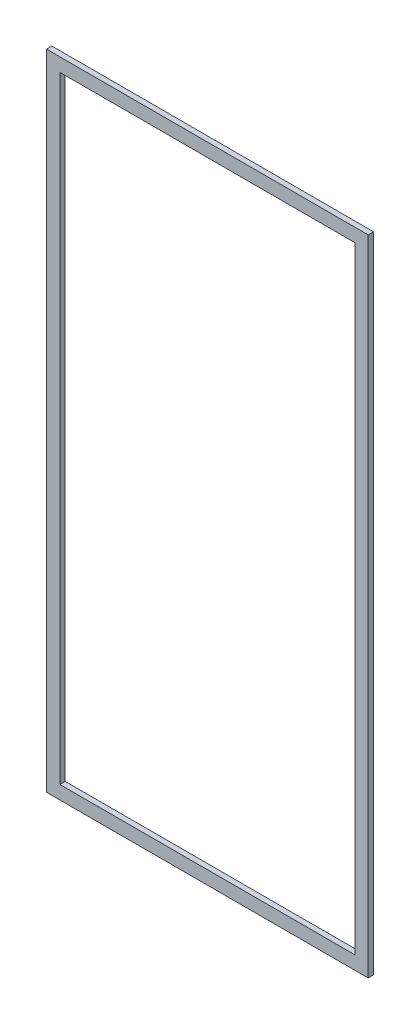
ISO-10303-21;
HEADER;
FILE_DESCRIPTION(('STEP AP214'),'2;1');
FILE_NAME('part.step','',(''),(''),'','','');
FILE_SCHEMA(('AUTOMOTIVE_DESIGN { 1 0 10303 214 1 1 1 1 }'));
ENDSEC;
DATA;
#1=APPLICATION_CONTEXT('core data for automotive mechanical design processes');
#2=APPLICATION_PROTOCOL_DEFINITION('international standard','automotive_design',2000,#1);
#3=PRODUCT_CONTEXT('',#1,'mechanical');
#4=PRODUCT('Part','Part','',(#3));
#5=PRODUCT_RELATED_PRODUCT_CATEGORY('part','',(#4));
#6=PRODUCT_DEFINITION_FORMATION('','',#4);
#7=PRODUCT_DEFINITION_CONTEXT('part definition',#1,'design');
#8=PRODUCT_DEFINITION('design','',#6,#7);
#9=PRODUCT_DEFINITION_SHAPE('','',#8);
#10=(LENGTH_UNIT() NAMED_UNIT(*) SI_UNIT(.MILLI.,.METRE.));
#11=(NAMED_UNIT(*) PLANE_ANGLE_UNIT() SI_UNIT($,.RADIAN.));
#12=(NAMED_UNIT(*) SI_UNIT($,.STERADIAN.) SOLID_ANGLE_UNIT());
#13=UNCERTAINTY_MEASURE_WITH_UNIT(LENGTH_MEASURE(1.E-05),#10,'distance_accuracy_value','');
#14=(GEOMETRIC_REPRESENTATION_CONTEXT(3) GLOBAL_UNCERTAINTY_ASSIGNED_CONTEXT((#13)) GLOBAL_UNIT_ASSIGNED_CONTEXT((#10,
#11,#12)) REPRESENTATION_CONTEXT('',''));
#15=CARTESIAN_POINT('',(0.,0.,0.));
#16=DIRECTION('',(0.,0.,1.));
#17=DIRECTION('',(1.,0.,0.));
#18=AXIS2_PLACEMENT_3D('',#15,#16,#17);
#19=CARTESIAN_POINT('',(0.,0.,10.));
#20=DIRECTION('',(0.,0.,1.));
#21=DIRECTION('',(1.,0.,0.));
#22=AXIS2_PLACEMENT_3D('',#19,#20,#21);
#23=PLANE('',#22);
#24=DIRECTION('',(0.,-1.,0.));
#25=VECTOR('',#24,1.);
#26=CARTESIAN_POINT('',(-300.,-600.,10.));
#27=LINE('',#26,#25);
#28=CARTESIAN_POINT('',(-300.,600.,10.));
#29=VERTEX_POINT('',#28);
#30=CARTESIAN_POINT('',(-300.,-600.,10.));
#31=VERTEX_POINT('',#30);
#32=EDGE_CURVE('E134',#29,#31,#27,.T.);
#33=ORIENTED_EDGE('',*,*,#32,.T.);
#34=DIRECTION('',(1.,0.,0.));
#35=VECTOR('',#34,1.);
#36=CARTESIAN_POINT('',(300.,-600.,10.));
#37=LINE('',#36,#35);
#38=CARTESIAN_POINT('',(300.,-600.,10.));
#39=VERTEX_POINT('',#38);
#40=EDGE_CURVE('E137',#31,#39,#37,.T.);
#41=ORIENTED_EDGE('',*,*,#40,.T.);
#42=DIRECTION('',(0.,1.,0.));
#43=VECTOR('',#42,1.);
#44=CARTESIAN_POINT('',(300.,-600.,10.));
#45=LINE('',#44,#43);
#46=CARTESIAN_POINT('',(300.,600.,10.));
#47=VERTEX_POINT('',#46);
#48=EDGE_CURVE('E140',#39,#47,#45,.T.);
#49=ORIENTED_EDGE('',*,*,#48,.T.);
#50=DIRECTION('',(-1.,0.,0.));
#51=VECTOR('',#50,1.);
#52=CARTESIAN_POINT('',(300.,600.,10.));
#53=LINE('',#52,#51);
#54=EDGE_CURVE('E142',#47,#29,#53,.T.);
#55=ORIENTED_EDGE('',*,*,#54,.T.);
#56=EDGE_LOOP('',(#33,#41,#49,#55));
#57=FACE_BOUND('',#56,.T.);
#58=DIRECTION('',(1.,0.,0.));
#59=VECTOR('',#58,1.);
#60=CARTESIAN_POINT('',(275.,-575.,10.));
#61=LINE('',#60,#59);
#62=CARTESIAN_POINT('',(-275.,-575.,10.));
#63=VERTEX_POINT('',#62);
#64=CARTESIAN_POINT('',(275.,-575.,10.));
#65=VERTEX_POINT('',#64);
#66=EDGE_CURVE('E106',#63,#65,#61,.T.);
#67=ORIENTED_EDGE('',*,*,#66,.F.);
#68=DIRECTION('',(0.,-1.,0.));
#69=VECTOR('',#68,1.);
#70=CARTESIAN_POINT('',(-275.,-575.,10.));
#71=LINE('',#70,#69);
#72=CARTESIAN_POINT('',(-275.,575.,10.));
#73=VERTEX_POINT('',#72);
#74=EDGE_CURVE('E98',#73,#63,#71,.T.);
#75=ORIENTED_EDGE('',*,*,#74,.F.);
#76=DIRECTION('',(-1.,0.,0.));
#77=VECTOR('',#76,1.);
#78=CARTESIAN_POINT('',(275.,575.,10.));
#79=LINE('',#78,#77);
#80=CARTESIAN_POINT('',(275.,575.,10.));
#81=VERTEX_POINT('',#80);
#82=EDGE_CURVE('E120',#81,#73,#79,.T.);
#83=ORIENTED_EDGE('',*,*,#82,.F.);
#84=DIRECTION('',(0.,1.,0.));
#85=VECTOR('',#84,1.);
#86=CARTESIAN_POINT('',(275.,-575.,10.));
#87=LINE('',#86,#85);
#88=EDGE_CURVE('E118',#65,#81,#87,.T.);
#89=ORIENTED_EDGE('',*,*,#88,.F.);
#90=EDGE_LOOP('',(#67,#75,#83,#89));
#91=FACE_BOUND('',#90,.T.);
#92=ADVANCED_FACE('F33',(#57,#91),#23,.T.);
#93=CARTESIAN_POINT('',(0.,0.,0.));
#94=DIRECTION('',(0.,0.,1.));
#95=DIRECTION('',(1.,0.,0.));
#96=AXIS2_PLACEMENT_3D('',#93,#94,#95);
#97=PLANE('',#96);
#98=DIRECTION('',(0.,-1.,0.));
#99=VECTOR('',#98,1.);
#100=CARTESIAN_POINT('',(-300.,-600.,0.));
#101=LINE('',#100,#99);
#102=CARTESIAN_POINT('',(-300.,600.,0.));
#103=VERTEX_POINT('',#102);
#104=CARTESIAN_POINT('',(-300.,-600.,0.));
#105=VERTEX_POINT('',#104);
#106=EDGE_CURVE('E114',#103,#105,#101,.T.);
#107=ORIENTED_EDGE('',*,*,#106,.F.);
#108=DIRECTION('',(-1.,0.,0.));
#109=VECTOR('',#108,1.);
#110=CARTESIAN_POINT('',(300.,600.,0.));
#111=LINE('',#110,#109);
#112=CARTESIAN_POINT('',(300.,600.,0.));
#113=VERTEX_POINT('',#112);
#114=EDGE_CURVE('E138',#113,#103,#111,.T.);
#115=ORIENTED_EDGE('',*,*,#114,.F.);
#116=DIRECTION('',(0.,1.,0.));
#117=VECTOR('',#116,1.);
#118=CARTESIAN_POINT('',(300.,-600.,0.));
#119=LINE('',#118,#117);
#120=CARTESIAN_POINT('',(300.,-600.,0.));
#121=VERTEX_POINT('',#120);
#122=EDGE_CURVE('E149',#121,#113,#119,.T.);
#123=ORIENTED_EDGE('',*,*,#122,.F.);
#124=DIRECTION('',(1.,0.,0.));
#125=VECTOR('',#124,1.);
#126=CARTESIAN_POINT('',(300.,-600.,0.));
#127=LINE('',#126,#125);
#128=EDGE_CURVE('E147',#105,#121,#127,.T.);
#129=ORIENTED_EDGE('',*,*,#128,.F.);
#130=EDGE_LOOP('',(#107,#115,#123,#129));
#131=FACE_BOUND('',#130,.T.);
#132=DIRECTION('',(0.,-1.,0.));
#133=VECTOR('',#132,1.);
#134=CARTESIAN_POINT('',(-275.,-575.,0.));
#135=LINE('',#134,#133);
#136=CARTESIAN_POINT('',(-275.,575.,0.));
#137=VERTEX_POINT('',#136);
#138=CARTESIAN_POINT('',(-275.,-575.,0.));
#139=VERTEX_POINT('',#138);
#140=EDGE_CURVE('E56',#137,#139,#135,.T.);
#141=ORIENTED_EDGE('',*,*,#140,.T.);
#142=DIRECTION('',(1.,0.,0.));
#143=VECTOR('',#142,1.);
#144=CARTESIAN_POINT('',(275.,-575.,0.));
#145=LINE('',#144,#143);
#146=CARTESIAN_POINT('',(275.,-575.,0.));
#147=VERTEX_POINT('',#146);
#148=EDGE_CURVE('E113',#139,#147,#145,.T.);
#149=ORIENTED_EDGE('',*,*,#148,.T.);
#150=DIRECTION('',(0.,1.,0.));
#151=VECTOR('',#150,1.);
#152=CARTESIAN_POINT('',(275.,-575.,0.));
#153=LINE('',#152,#151);
#154=CARTESIAN_POINT('',(275.,575.,0.));
#155=VERTEX_POINT('',#154);
#156=EDGE_CURVE('E126',#147,#155,#153,.T.);
#157=ORIENTED_EDGE('',*,*,#156,.T.);
#158=DIRECTION('',(-1.,0.,0.));
#159=VECTOR('',#158,1.);
#160=CARTESIAN_POINT('',(275.,575.,0.));
#161=LINE('',#160,#159);
#162=EDGE_CURVE('E107',#155,#137,#161,.T.);
#163=ORIENTED_EDGE('',*,*,#162,.T.);
#164=EDGE_LOOP('',(#141,#149,#157,#163));
#165=FACE_BOUND('',#164,.T.);
#166=ADVANCED_FACE('F167',(#131,#165),#97,.F.);
#167=CARTESIAN_POINT('',(-300.,-600.,10.));
#168=DIRECTION('',(1.,0.,0.));
#169=DIRECTION('',(0.,1.,0.));
#170=AXIS2_PLACEMENT_3D('',#167,#168,#169);
#171=PLANE('',#170);
#172=ORIENTED_EDGE('',*,*,#106,.T.);
#173=DIRECTION('',(0.,0.,-1.));
#174=VECTOR('',#173,1.);
#175=CARTESIAN_POINT('',(-300.,-600.,10.));
#176=LINE('',#175,#174);
#177=EDGE_CURVE('E11',#31,#105,#176,.T.);
#178=ORIENTED_EDGE('',*,*,#177,.F.);
#179=ORIENTED_EDGE('',*,*,#32,.F.);
#180=DIRECTION('',(0.,0.,-1.));
#181=VECTOR('',#180,1.);
#182=CARTESIAN_POINT('',(-300.,600.,10.));
#183=LINE('',#182,#181);
#184=EDGE_CURVE('E144',#29,#103,#183,.T.);
#185=ORIENTED_EDGE('',*,*,#184,.T.);
#186=EDGE_LOOP('',(#172,#178,#179,#185));
#187=FACE_BOUND('',#186,.T.);
#188=ADVANCED_FACE('F35',(#187),#171,.F.);
#189=CARTESIAN_POINT('',(300.,-600.,10.));
#190=DIRECTION('',(0.,1.,0.));
#191=DIRECTION('',(-1.,0.,0.));
#192=AXIS2_PLACEMENT_3D('',#189,#190,#191);
#193=PLANE('',#192);
#194=ORIENTED_EDGE('',*,*,#128,.T.);
#195=DIRECTION('',(0.,0.,-1.));
#196=VECTOR('',#195,1.);
#197=CARTESIAN_POINT('',(300.,-600.,10.));
#198=LINE('',#197,#196);
#199=EDGE_CURVE('E41',#39,#121,#198,.T.);
#200=ORIENTED_EDGE('',*,*,#199,.F.);
#201=ORIENTED_EDGE('',*,*,#40,.F.);
#202=ORIENTED_EDGE('',*,*,#177,.T.);
#203=EDGE_LOOP('',(#194,#200,#201,#202));
#204=FACE_BOUND('',#203,.T.);
#205=ADVANCED_FACE('F177',(#204),#193,.F.);
#206=CARTESIAN_POINT('',(300.,-600.,10.));
#207=DIRECTION('',(-1.,0.,0.));
#208=DIRECTION('',(0.,0.,1.));
#209=AXIS2_PLACEMENT_3D('',#206,#207,#208);
#210=PLANE('',#209);
#211=ORIENTED_EDGE('',*,*,#122,.T.);
#212=DIRECTION('',(0.,0.,-1.));
#213=VECTOR('',#212,1.);
#214=CARTESIAN_POINT('',(300.,600.,10.));
#215=LINE('',#214,#213);
#216=EDGE_CURVE('E154',#47,#113,#215,.T.);
#217=ORIENTED_EDGE('',*,*,#216,.F.);
#218=ORIENTED_EDGE('',*,*,#48,.F.);
#219=ORIENTED_EDGE('',*,*,#199,.T.);
#220=EDGE_LOOP('',(#211,#217,#218,#219));
#221=FACE_BOUND('',#220,.T.);
#222=ADVANCED_FACE('F161',(#221),#210,.F.);
#223=CARTESIAN_POINT('',(300.,600.,10.));
#224=DIRECTION('',(0.,-1.,0.));
#225=DIRECTION('',(1.,0.,0.));
#226=AXIS2_PLACEMENT_3D('',#223,#224,#225);
#227=PLANE('',#226);
#228=ORIENTED_EDGE('',*,*,#114,.T.);
#229=ORIENTED_EDGE('',*,*,#184,.F.);
#230=ORIENTED_EDGE('',*,*,#54,.F.);
#231=ORIENTED_EDGE('',*,*,#216,.T.);
#232=EDGE_LOOP('',(#228,#229,#230,#231));
#233=FACE_BOUND('',#232,.T.);
#234=ADVANCED_FACE('F171',(#233),#227,.F.);
#235=CARTESIAN_POINT('',(-275.,-575.,10.));
#236=DIRECTION('',(1.,0.,0.));
#237=DIRECTION('',(0.,0.,-1.));
#238=AXIS2_PLACEMENT_3D('',#235,#236,#237);
#239=PLANE('',#238);
#240=ORIENTED_EDGE('',*,*,#140,.F.);
#241=DIRECTION('',(0.,0.,-1.));
#242=VECTOR('',#241,1.);
#243=CARTESIAN_POINT('',(-275.,575.,10.));
#244=LINE('',#243,#242);
#245=EDGE_CURVE('E102',#73,#137,#244,.T.);
#246=ORIENTED_EDGE('',*,*,#245,.F.);
#247=ORIENTED_EDGE('',*,*,#74,.T.);
#248=DIRECTION('',(0.,0.,-1.));
#249=VECTOR('',#248,1.);
#250=CARTESIAN_POINT('',(-275.,-575.,10.));
#251=LINE('',#250,#249);
#252=EDGE_CURVE('E101',#63,#139,#251,.T.);
#253=ORIENTED_EDGE('',*,*,#252,.T.);
#254=EDGE_LOOP('',(#240,#246,#247,#253));
#255=FACE_BOUND('',#254,.T.);
#256=ADVANCED_FACE('F100',(#255),#239,.T.);
#257=CARTESIAN_POINT('',(275.,-575.,10.));
#258=DIRECTION('',(0.,1.,0.));
#259=DIRECTION('',(-1.,0.,0.));
#260=AXIS2_PLACEMENT_3D('',#257,#258,#259);
#261=PLANE('',#260);
#262=ORIENTED_EDGE('',*,*,#148,.F.);
#263=ORIENTED_EDGE('',*,*,#252,.F.);
#264=ORIENTED_EDGE('',*,*,#66,.T.);
#265=DIRECTION('',(0.,0.,-1.));
#266=VECTOR('',#265,1.);
#267=CARTESIAN_POINT('',(275.,-575.,10.));
#268=LINE('',#267,#266);
#269=EDGE_CURVE('E115',#65,#147,#268,.T.);
#270=ORIENTED_EDGE('',*,*,#269,.T.);
#271=EDGE_LOOP('',(#262,#263,#264,#270));
#272=FACE_BOUND('',#271,.T.);
#273=ADVANCED_FACE('F110',(#272),#261,.T.);
#274=CARTESIAN_POINT('',(275.,-575.,10.));
#275=DIRECTION('',(-1.,0.,0.));
#276=DIRECTION('',(0.,0.,1.));
#277=AXIS2_PLACEMENT_3D('',#274,#275,#276);
#278=PLANE('',#277);
#279=ORIENTED_EDGE('',*,*,#156,.F.);
#280=ORIENTED_EDGE('',*,*,#269,.F.);
#281=ORIENTED_EDGE('',*,*,#88,.T.);
#282=DIRECTION('',(0.,0.,-1.));
#283=VECTOR('',#282,1.);
#284=CARTESIAN_POINT('',(275.,575.,10.));
#285=LINE('',#284,#283);
#286=EDGE_CURVE('E48',#81,#155,#285,.T.);
#287=ORIENTED_EDGE('',*,*,#286,.T.);
#288=EDGE_LOOP('',(#279,#280,#281,#287));
#289=FACE_BOUND('',#288,.T.);
#290=ADVANCED_FACE('F200',(#289),#278,.T.);
#291=CARTESIAN_POINT('',(275.,575.,10.));
#292=DIRECTION('',(0.,-1.,0.));
#293=DIRECTION('',(1.,0.,0.));
#294=AXIS2_PLACEMENT_3D('',#291,#292,#293);
#295=PLANE('',#294);
#296=ORIENTED_EDGE('',*,*,#162,.F.);
#297=ORIENTED_EDGE('',*,*,#286,.F.);
#298=ORIENTED_EDGE('',*,*,#82,.T.);
#299=ORIENTED_EDGE('',*,*,#245,.T.);
#300=EDGE_LOOP('',(#296,#297,#298,#299));
#301=FACE_BOUND('',#300,.T.);
#302=ADVANCED_FACE('F204',(#301),#295,.T.);
#303=CLOSED_SHELL('',(#92,#166,#188,#205,#222,#234,#256,#273,#290,#302));
#304=MANIFOLD_SOLID_BREP('B2',#303);
#305=ADVANCED_BREP_SHAPE_REPRESENTATION('',(#18,#304),#14);
#306=SHAPE_DEFINITION_REPRESENTATION(#9,#305);
ENDSEC;
END-ISO-10303-21;
